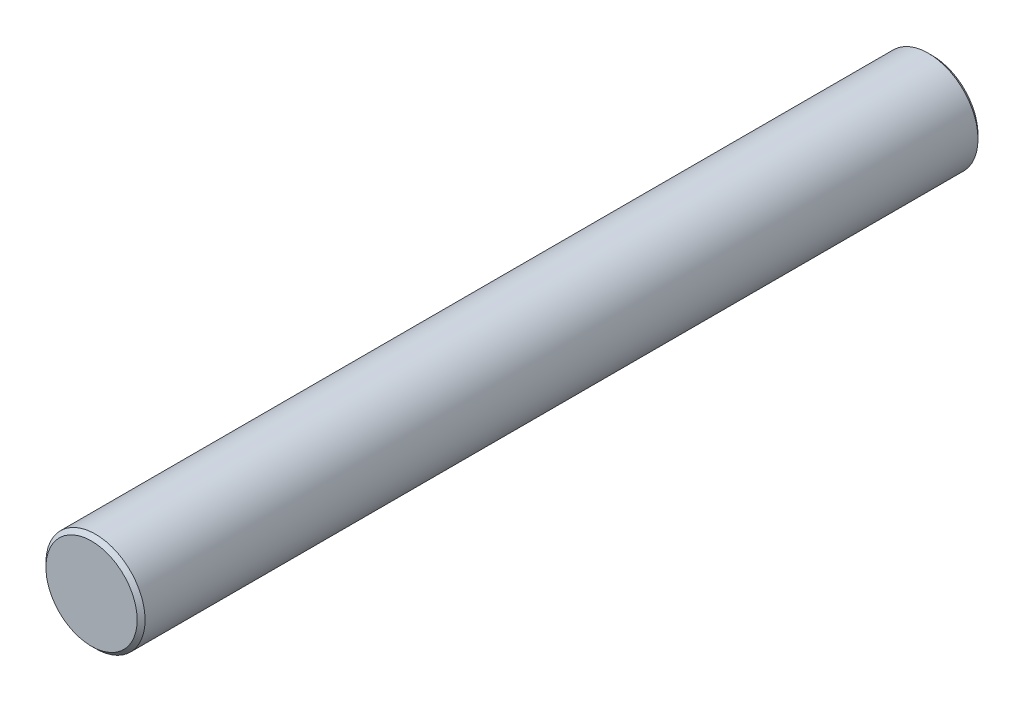
ISO-10303-21;
HEADER;
FILE_DESCRIPTION(('STEP AP214'),'2;1');
FILE_NAME('part.step','',(''),(''),'','','');
FILE_SCHEMA(('AUTOMOTIVE_DESIGN { 1 0 10303 214 1 1 1 1 }'));
ENDSEC;
DATA;
#1=APPLICATION_CONTEXT('core data for automotive mechanical design processes');
#2=APPLICATION_PROTOCOL_DEFINITION('international standard','automotive_design',2000,#1);
#3=PRODUCT_CONTEXT('',#1,'mechanical');
#4=PRODUCT('Part','Part','',(#3));
#5=PRODUCT_RELATED_PRODUCT_CATEGORY('part','',(#4));
#6=PRODUCT_DEFINITION_FORMATION('','',#4);
#7=PRODUCT_DEFINITION_CONTEXT('part definition',#1,'design');
#8=PRODUCT_DEFINITION('design','',#6,#7);
#9=PRODUCT_DEFINITION_SHAPE('','',#8);
#10=(LENGTH_UNIT() NAMED_UNIT(*) SI_UNIT(.MILLI.,.METRE.));
#11=(NAMED_UNIT(*) PLANE_ANGLE_UNIT() SI_UNIT($,.RADIAN.));
#12=(NAMED_UNIT(*) SI_UNIT($,.STERADIAN.) SOLID_ANGLE_UNIT());
#13=UNCERTAINTY_MEASURE_WITH_UNIT(LENGTH_MEASURE(1.E-05),#10,'distance_accuracy_value','');
#14=(GEOMETRIC_REPRESENTATION_CONTEXT(3) GLOBAL_UNCERTAINTY_ASSIGNED_CONTEXT((#13)) GLOBAL_UNIT_ASSIGNED_CONTEXT((#10,
#11,#12)) REPRESENTATION_CONTEXT('',''));
#15=CARTESIAN_POINT('',(0.,0.,0.));
#16=DIRECTION('',(0.,0.,1.));
#17=DIRECTION('',(1.,0.,0.));
#18=AXIS2_PLACEMENT_3D('',#15,#16,#17);
#19=CARTESIAN_POINT('',(0.,0.,106.));
#20=DIRECTION('',(0.,0.,-1.));
#21=DIRECTION('',(-1.,0.,0.));
#22=AXIS2_PLACEMENT_3D('',#19,#20,#21);
#23=CYLINDRICAL_SURFACE('',#22,12.5);
#24=CARTESIAN_POINT('',(0.,0.,-105.));
#25=DIRECTION('',(0.,0.,1.));
#26=DIRECTION('',(1.,0.,0.));
#27=AXIS2_PLACEMENT_3D('',#24,#25,#26);
#28=CIRCLE('',#27,12.5);
#29=CARTESIAN_POINT('',(12.5,0.,-105.));
#30=VERTEX_POINT('',#29);
#31=EDGE_CURVE('E43',#30,#30,#28,.T.);
#32=ORIENTED_EDGE('',*,*,#31,.T.);
#33=EDGE_LOOP('',(#32));
#34=FACE_BOUND('',#33,.T.);
#35=CARTESIAN_POINT('',(0.,0.,105.));
#36=DIRECTION('',(0.,0.,1.));
#37=DIRECTION('',(1.,0.,0.));
#38=AXIS2_PLACEMENT_3D('',#35,#36,#37);
#39=CIRCLE('',#38,12.5);
#40=CARTESIAN_POINT('',(12.5,0.,105.));
#41=VERTEX_POINT('',#40);
#42=EDGE_CURVE('E47',#41,#41,#39,.F.);
#43=ORIENTED_EDGE('',*,*,#42,.T.);
#44=EDGE_LOOP('',(#43));
#45=FACE_BOUND('',#44,.T.);
#46=ADVANCED_FACE('F32',(#34,#45),#23,.T.);
#47=CARTESIAN_POINT('',(0.,0.,106.));
#48=DIRECTION('',(0.,0.,1.));
#49=DIRECTION('',(1.,0.,0.));
#50=AXIS2_PLACEMENT_3D('',#47,#48,#49);
#51=PLANE('',#50);
#52=CARTESIAN_POINT('',(0.,0.,106.));
#53=DIRECTION('',(0.,0.,1.));
#54=DIRECTION('',(1.,0.,0.));
#55=AXIS2_PLACEMENT_3D('',#52,#53,#54);
#56=CIRCLE('',#55,11.5);
#57=CARTESIAN_POINT('',(11.5,0.,106.));
#58=VERTEX_POINT('',#57);
#59=EDGE_CURVE('E10',#58,#58,#56,.T.);
#60=ORIENTED_EDGE('',*,*,#59,.T.);
#61=EDGE_LOOP('',(#60));
#62=FACE_BOUND('',#61,.T.);
#63=ADVANCED_FACE('F63',(#62),#51,.T.);
#64=CARTESIAN_POINT('',(0.,0.,-106.));
#65=DIRECTION('',(0.,0.,1.));
#66=DIRECTION('',(1.,0.,0.));
#67=AXIS2_PLACEMENT_3D('',#64,#65,#66);
#68=PLANE('',#67);
#69=CARTESIAN_POINT('',(0.,0.,-106.));
#70=DIRECTION('',(0.,0.,1.));
#71=DIRECTION('',(1.,0.,0.));
#72=AXIS2_PLACEMENT_3D('',#69,#70,#71);
#73=CIRCLE('',#72,11.5);
#74=CARTESIAN_POINT('',(11.5,0.,-106.));
#75=VERTEX_POINT('',#74);
#76=EDGE_CURVE('E39',#75,#75,#73,.F.);
#77=ORIENTED_EDGE('',*,*,#76,.T.);
#78=EDGE_LOOP('',(#77));
#79=FACE_BOUND('',#78,.T.);
#80=ADVANCED_FACE('F60',(#79),#68,.F.);
#81=CARTESIAN_POINT('',(0.,0.,-105.));
#82=DIRECTION('',(0.,0.,1.));
#83=DIRECTION('',(1.,0.,0.));
#84=AXIS2_PLACEMENT_3D('',#81,#82,#83);
#85=CONICAL_SURFACE('',#84,12.5,0.785398163397444);
#86=ORIENTED_EDGE('',*,*,#76,.F.);
#87=EDGE_LOOP('',(#86));
#88=FACE_BOUND('',#87,.T.);
#89=ORIENTED_EDGE('',*,*,#31,.F.);
#90=EDGE_LOOP('',(#89));
#91=FACE_BOUND('',#90,.T.);
#92=ADVANCED_FACE('F56',(#88,#91),#85,.T.);
#93=CARTESIAN_POINT('',(0.,0.,106.));
#94=DIRECTION('',(0.,0.,-1.));
#95=DIRECTION('',(-1.,0.,0.));
#96=AXIS2_PLACEMENT_3D('',#93,#94,#95);
#97=CONICAL_SURFACE('',#96,11.5,0.785398163397443);
#98=ORIENTED_EDGE('',*,*,#42,.F.);
#99=EDGE_LOOP('',(#98));
#100=FACE_BOUND('',#99,.T.);
#101=ORIENTED_EDGE('',*,*,#59,.F.);
#102=EDGE_LOOP('',(#101));
#103=FACE_BOUND('',#102,.T.);
#104=ADVANCED_FACE('F34',(#100,#103),#97,.T.);
#105=CLOSED_SHELL('',(#46,#63,#80,#92,#104));
#106=MANIFOLD_SOLID_BREP('B2',#105);
#107=ADVANCED_BREP_SHAPE_REPRESENTATION('',(#18,#106),#14);
#108=SHAPE_DEFINITION_REPRESENTATION(#9,#107);
ENDSEC;
END-ISO-10303-21;
